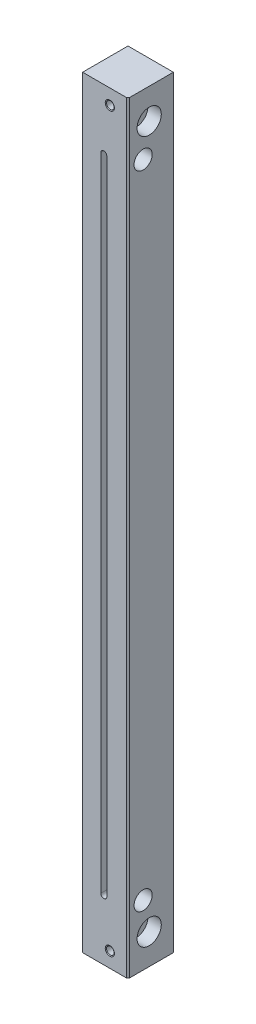
ISO-10303-21;
HEADER;
FILE_DESCRIPTION(('STEP AP214'),'2;1');
FILE_NAME('part.step','',(''),(''),'','','');
FILE_SCHEMA(('AUTOMOTIVE_DESIGN { 1 0 10303 214 1 1 1 1 }'));
ENDSEC;
DATA;
#1=APPLICATION_CONTEXT('core data for automotive mechanical design processes');
#2=APPLICATION_PROTOCOL_DEFINITION('international standard','automotive_design',2000,#1);
#3=PRODUCT_CONTEXT('',#1,'mechanical');
#4=PRODUCT('Part','Part','',(#3));
#5=PRODUCT_RELATED_PRODUCT_CATEGORY('part','',(#4));
#6=PRODUCT_DEFINITION_FORMATION('','',#4);
#7=PRODUCT_DEFINITION_CONTEXT('part definition',#1,'design');
#8=PRODUCT_DEFINITION('design','',#6,#7);
#9=PRODUCT_DEFINITION_SHAPE('','',#8);
#10=(LENGTH_UNIT() NAMED_UNIT(*) SI_UNIT(.MILLI.,.METRE.));
#11=(NAMED_UNIT(*) PLANE_ANGLE_UNIT() SI_UNIT($,.RADIAN.));
#12=(NAMED_UNIT(*) SI_UNIT($,.STERADIAN.) SOLID_ANGLE_UNIT());
#13=UNCERTAINTY_MEASURE_WITH_UNIT(LENGTH_MEASURE(1.E-05),#10,'distance_accuracy_value','');
#14=(GEOMETRIC_REPRESENTATION_CONTEXT(3) GLOBAL_UNCERTAINTY_ASSIGNED_CONTEXT((#13)) GLOBAL_UNIT_ASSIGNED_CONTEXT((#10,
#11,#12)) REPRESENTATION_CONTEXT('',''));
#15=CARTESIAN_POINT('',(0.,0.,0.));
#16=DIRECTION('',(0.,0.,1.));
#17=DIRECTION('',(1.,0.,0.));
#18=AXIS2_PLACEMENT_3D('',#15,#16,#17);
#19=CARTESIAN_POINT('',(0.,252.,15.));
#20=DIRECTION('',(0.,0.,-1.));
#21=DIRECTION('',(-1.,0.,0.));
#22=AXIS2_PLACEMENT_3D('',#19,#20,#21);
#23=PLANE('',#22);
#24=CARTESIAN_POINT('',(9.,5.,15.));
#25=DIRECTION('',(0.,0.,1.));
#26=DIRECTION('',(1.,0.,0.));
#27=AXIS2_PLACEMENT_3D('',#24,#25,#26);
#28=CIRCLE('',#27,1.525);
#29=CARTESIAN_POINT('',(10.525,5.,15.));
#30=VERTEX_POINT('',#29);
#31=EDGE_CURVE('E248',#30,#30,#28,.T.);
#32=ORIENTED_EDGE('',*,*,#31,.F.);
#33=EDGE_LOOP('',(#32));
#34=FACE_BOUND('',#33,.T.);
#35=CARTESIAN_POINT('',(9.,247.,15.));
#36=DIRECTION('',(0.,0.,1.));
#37=DIRECTION('',(1.,0.,0.));
#38=AXIS2_PLACEMENT_3D('',#35,#36,#37);
#39=CIRCLE('',#38,1.525);
#40=CARTESIAN_POINT('',(10.525,247.,15.));
#41=VERTEX_POINT('',#40);
#42=EDGE_CURVE('E257',#41,#41,#39,.T.);
#43=ORIENTED_EDGE('',*,*,#42,.F.);
#44=EDGE_LOOP('',(#43));
#45=FACE_BOUND('',#44,.T.);
#46=DIRECTION('',(0.,-1.,0.));
#47=VECTOR('',#46,1.);
#48=CARTESIAN_POINT('',(5.99999999999997,232.,15.));
#49=LINE('',#48,#47);
#50=CARTESIAN_POINT('',(5.99999999999997,232.,15.));
#51=VERTEX_POINT('',#50);
#52=CARTESIAN_POINT('',(6.,20.,15.));
#53=VERTEX_POINT('',#52);
#54=EDGE_CURVE('E268',#51,#53,#49,.T.);
#55=ORIENTED_EDGE('',*,*,#54,.F.);
#56=CARTESIAN_POINT('',(6.99999999999997,232.,15.));
#57=DIRECTION('',(0.,0.,1.));
#58=DIRECTION('',(1.,0.,0.));
#59=AXIS2_PLACEMENT_3D('',#56,#57,#58);
#60=CIRCLE('',#59,1.);
#61=CARTESIAN_POINT('',(7.99999999999997,232.,15.));
#62=VERTEX_POINT('',#61);
#63=EDGE_CURVE('E266',#62,#51,#60,.T.);
#64=ORIENTED_EDGE('',*,*,#63,.F.);
#65=DIRECTION('',(0.,1.,0.));
#66=VECTOR('',#65,1.);
#67=CARTESIAN_POINT('',(7.99999999999997,232.,15.));
#68=LINE('',#67,#66);
#69=CARTESIAN_POINT('',(8.,20.,15.));
#70=VERTEX_POINT('',#69);
#71=EDGE_CURVE('E274',#70,#62,#68,.T.);
#72=ORIENTED_EDGE('',*,*,#71,.F.);
#73=CARTESIAN_POINT('',(7.,20.,15.));
#74=DIRECTION('',(0.,0.,1.));
#75=DIRECTION('',(1.,0.,0.));
#76=AXIS2_PLACEMENT_3D('',#73,#74,#75);
#77=CIRCLE('',#76,1.);
#78=EDGE_CURVE('E271',#53,#70,#77,.T.);
#79=ORIENTED_EDGE('',*,*,#78,.F.);
#80=EDGE_LOOP('',(#55,#64,#72,#79));
#81=FACE_BOUND('',#80,.T.);
#82=DIRECTION('',(1.,0.,0.));
#83=VECTOR('',#82,1.);
#84=CARTESIAN_POINT('',(0.,0.,15.));
#85=LINE('',#84,#83);
#86=CARTESIAN_POINT('',(0.,0.,15.));
#87=VERTEX_POINT('',#86);
#88=CARTESIAN_POINT('',(14.5,0.,15.));
#89=VERTEX_POINT('',#88);
#90=EDGE_CURVE('E305',#87,#89,#85,.T.);
#91=ORIENTED_EDGE('',*,*,#90,.T.);
#92=DIRECTION('',(0.,1.,0.));
#93=VECTOR('',#92,1.);
#94=CARTESIAN_POINT('',(14.5,252.,15.));
#95=LINE('',#94,#93);
#96=CARTESIAN_POINT('',(14.5,252.,15.));
#97=VERTEX_POINT('',#96);
#98=EDGE_CURVE('E343',#89,#97,#95,.T.);
#99=ORIENTED_EDGE('',*,*,#98,.T.);
#100=DIRECTION('',(-1.,0.,0.));
#101=VECTOR('',#100,1.);
#102=CARTESIAN_POINT('',(0.,252.,15.));
#103=LINE('',#102,#101);
#104=CARTESIAN_POINT('',(0.,252.,15.));
#105=VERTEX_POINT('',#104);
#106=EDGE_CURVE('E405',#97,#105,#103,.T.);
#107=ORIENTED_EDGE('',*,*,#106,.T.);
#108=DIRECTION('',(0.,-1.,0.));
#109=VECTOR('',#108,1.);
#110=CARTESIAN_POINT('',(0.,0.,15.));
#111=LINE('',#110,#109);
#112=EDGE_CURVE('E308',#105,#87,#111,.T.);
#113=ORIENTED_EDGE('',*,*,#112,.T.);
#114=EDGE_LOOP('',(#91,#99,#107,#113));
#115=FACE_BOUND('',#114,.T.);
#116=ADVANCED_FACE('F38',(#34,#45,#81,#115),#23,.F.);
#117=CARTESIAN_POINT('',(0.,0.,15.));
#118=DIRECTION('',(1.,0.,0.));
#119=DIRECTION('',(0.,0.,-1.));
#120=AXIS2_PLACEMENT_3D('',#117,#118,#119);
#121=PLANE('',#120);
#122=CARTESIAN_POINT('',(0.,10.,8.));
#123=DIRECTION('',(1.,0.,0.));
#124=DIRECTION('',(0.,0.,-1.));
#125=AXIS2_PLACEMENT_3D('',#122,#123,#124);
#126=CIRCLE('',#125,2.25);
#127=CARTESIAN_POINT('',(0.,10.,5.75));
#128=VERTEX_POINT('',#127);
#129=EDGE_CURVE('E233',#128,#128,#126,.T.);
#130=ORIENTED_EDGE('',*,*,#129,.T.);
#131=EDGE_LOOP('',(#130));
#132=FACE_BOUND('',#131,.T.);
#133=CARTESIAN_POINT('',(0.,242.,8.));
#134=DIRECTION('',(1.,0.,0.));
#135=DIRECTION('',(0.,0.,-1.));
#136=AXIS2_PLACEMENT_3D('',#133,#134,#135);
#137=CIRCLE('',#136,2.25);
#138=CARTESIAN_POINT('',(0.,242.,5.75));
#139=VERTEX_POINT('',#138);
#140=EDGE_CURVE('E245',#139,#139,#137,.T.);
#141=ORIENTED_EDGE('',*,*,#140,.T.);
#142=EDGE_LOOP('',(#141));
#143=FACE_BOUND('',#142,.T.);
#144=DIRECTION('',(0.,0.,-1.));
#145=VECTOR('',#144,1.);
#146=CARTESIAN_POINT('',(0.,238.5,21.));
#147=LINE('',#146,#145);
#148=CARTESIAN_POINT('',(0.,238.5,7.));
#149=VERTEX_POINT('',#148);
#150=CARTESIAN_POINT('',(0.,238.5,0.));
#151=VERTEX_POINT('',#150);
#152=EDGE_CURVE('E302',#149,#151,#147,.T.);
#153=ORIENTED_EDGE('',*,*,#152,.F.);
#154=CARTESIAN_POINT('',(0.,233.5,7.));
#155=DIRECTION('',(1.,0.,0.));
#156=DIRECTION('',(0.,0.,-1.));
#157=AXIS2_PLACEMENT_3D('',#154,#155,#156);
#158=CIRCLE('',#157,5.);
#159=CARTESIAN_POINT('',(0.,233.5,12.));
#160=VERTEX_POINT('',#159);
#161=EDGE_CURVE('E339',#149,#160,#158,.T.);
#162=ORIENTED_EDGE('',*,*,#161,.T.);
#163=DIRECTION('',(0.,-1.,0.));
#164=VECTOR('',#163,1.);
#165=CARTESIAN_POINT('',(0.,13.5,12.));
#166=LINE('',#165,#164);
#167=CARTESIAN_POINT('',(0.,18.5,12.));
#168=VERTEX_POINT('',#167);
#169=EDGE_CURVE('E280',#160,#168,#166,.T.);
#170=ORIENTED_EDGE('',*,*,#169,.T.);
#171=CARTESIAN_POINT('',(0.,18.5,7.));
#172=DIRECTION('',(1.,0.,0.));
#173=DIRECTION('',(0.,0.,-1.));
#174=AXIS2_PLACEMENT_3D('',#171,#172,#173);
#175=CIRCLE('',#174,5.);
#176=CARTESIAN_POINT('',(0.,13.5,7.));
#177=VERTEX_POINT('',#176);
#178=EDGE_CURVE('E341',#168,#177,#175,.T.);
#179=ORIENTED_EDGE('',*,*,#178,.T.);
#180=DIRECTION('',(0.,0.,-1.));
#181=VECTOR('',#180,1.);
#182=CARTESIAN_POINT('',(0.,13.5,21.));
#183=LINE('',#182,#181);
#184=CARTESIAN_POINT('',(0.,13.5,0.));
#185=VERTEX_POINT('',#184);
#186=EDGE_CURVE('E297',#177,#185,#183,.T.);
#187=ORIENTED_EDGE('',*,*,#186,.T.);
#188=DIRECTION('',(0.,-1.,0.));
#189=VECTOR('',#188,1.);
#190=CARTESIAN_POINT('',(0.,0.,0.));
#191=LINE('',#190,#189);
#192=CARTESIAN_POINT('',(0.,0.,0.));
#193=VERTEX_POINT('',#192);
#194=EDGE_CURVE('E321',#185,#193,#191,.T.);
#195=ORIENTED_EDGE('',*,*,#194,.T.);
#196=DIRECTION('',(0.,0.,-1.));
#197=VECTOR('',#196,1.);
#198=CARTESIAN_POINT('',(0.,0.,15.));
#199=LINE('',#198,#197);
#200=EDGE_CURVE('E312',#87,#193,#199,.T.);
#201=ORIENTED_EDGE('',*,*,#200,.F.);
#202=ORIENTED_EDGE('',*,*,#112,.F.);
#203=DIRECTION('',(0.,0.,-1.));
#204=VECTOR('',#203,1.);
#205=CARTESIAN_POINT('',(0.,252.,15.));
#206=LINE('',#205,#204);
#207=CARTESIAN_POINT('',(0.,252.,0.));
#208=VERTEX_POINT('',#207);
#209=EDGE_CURVE('E398',#105,#208,#206,.T.);
#210=ORIENTED_EDGE('',*,*,#209,.T.);
#211=EDGE_CURVE('E395',#208,#151,#191,.T.);
#212=ORIENTED_EDGE('',*,*,#211,.T.);
#213=EDGE_LOOP('',(#153,#162,#170,#179,#187,#195,#201,#202,#210,#212));
#214=FACE_BOUND('',#213,.T.);
#215=ADVANCED_FACE('F384',(#132,#143,#214),#121,.F.);
#216=CARTESIAN_POINT('',(0.,0.,15.));
#217=DIRECTION('',(0.,1.,0.));
#218=DIRECTION('',(0.,0.,1.));
#219=AXIS2_PLACEMENT_3D('',#216,#217,#218);
#220=PLANE('',#219);
#221=DIRECTION('',(0.,0.,-1.));
#222=VECTOR('',#221,1.);
#223=CARTESIAN_POINT('',(15.,0.,15.));
#224=LINE('',#223,#222);
#225=CARTESIAN_POINT('',(15.,0.,14.5));
#226=VERTEX_POINT('',#225);
#227=CARTESIAN_POINT('',(15.,0.,0.));
#228=VERTEX_POINT('',#227);
#229=EDGE_CURVE('E412',#226,#228,#224,.T.);
#230=ORIENTED_EDGE('',*,*,#229,.F.);
#231=DIRECTION('',(0.707106781186528,0.,-0.707106781186567));
#232=VECTOR('',#231,1.);
#233=CARTESIAN_POINT('',(14.5,0.,15.));
#234=LINE('',#233,#232);
#235=EDGE_CURVE('E350',#226,#89,#234,.F.);
#236=ORIENTED_EDGE('',*,*,#235,.T.);
#237=ORIENTED_EDGE('',*,*,#90,.F.);
#238=ORIENTED_EDGE('',*,*,#200,.T.);
#239=DIRECTION('',(1.,0.,0.));
#240=VECTOR('',#239,1.);
#241=CARTESIAN_POINT('',(0.,0.,0.));
#242=LINE('',#241,#240);
#243=EDGE_CURVE('E400',#193,#228,#242,.T.);
#244=ORIENTED_EDGE('',*,*,#243,.T.);
#245=EDGE_LOOP('',(#230,#236,#237,#238,#244));
#246=FACE_BOUND('',#245,.T.);
#247=ADVANCED_FACE('F449',(#246),#220,.F.);
#248=CARTESIAN_POINT('',(15.,0.,15.));
#249=DIRECTION('',(-1.,0.,0.));
#250=DIRECTION('',(0.,0.,1.));
#251=AXIS2_PLACEMENT_3D('',#248,#249,#250);
#252=PLANE('',#251);
#253=CARTESIAN_POINT('',(15.,20.,10.));
#254=DIRECTION('',(1.,0.,0.));
#255=DIRECTION('',(0.,0.,-1.));
#256=AXIS2_PLACEMENT_3D('',#253,#254,#255);
#257=CIRCLE('',#256,3.);
#258=CARTESIAN_POINT('',(15.,20.,7.));
#259=VERTEX_POINT('',#258);
#260=EDGE_CURVE('E212',#259,#259,#257,.T.);
#261=ORIENTED_EDGE('',*,*,#260,.F.);
#262=EDGE_LOOP('',(#261));
#263=FACE_BOUND('',#262,.T.);
#264=CARTESIAN_POINT('',(15.,232.,10.));
#265=DIRECTION('',(1.,0.,0.));
#266=DIRECTION('',(0.,0.,-1.));
#267=AXIS2_PLACEMENT_3D('',#264,#265,#266);
#268=CIRCLE('',#267,3.);
#269=CARTESIAN_POINT('',(15.,232.,7.));
#270=VERTEX_POINT('',#269);
#271=EDGE_CURVE('E216',#270,#270,#268,.T.);
#272=ORIENTED_EDGE('',*,*,#271,.F.);
#273=EDGE_LOOP('',(#272));
#274=FACE_BOUND('',#273,.T.);
#275=CARTESIAN_POINT('',(15.,10.,8.));
#276=DIRECTION('',(1.,0.,0.));
#277=DIRECTION('',(0.,0.,-1.));
#278=AXIS2_PLACEMENT_3D('',#275,#276,#277);
#279=CIRCLE('',#278,4.);
#280=CARTESIAN_POINT('',(15.,10.,4.));
#281=VERTEX_POINT('',#280);
#282=EDGE_CURVE('E222',#281,#281,#279,.T.);
#283=ORIENTED_EDGE('',*,*,#282,.F.);
#284=EDGE_LOOP('',(#283));
#285=FACE_BOUND('',#284,.T.);
#286=CARTESIAN_POINT('',(15.,242.,8.));
#287=DIRECTION('',(1.,0.,0.));
#288=DIRECTION('',(0.,0.,-1.));
#289=AXIS2_PLACEMENT_3D('',#286,#287,#288);
#290=CIRCLE('',#289,4.);
#291=CARTESIAN_POINT('',(15.,242.,4.));
#292=VERTEX_POINT('',#291);
#293=EDGE_CURVE('E236',#292,#292,#290,.T.);
#294=ORIENTED_EDGE('',*,*,#293,.F.);
#295=EDGE_LOOP('',(#294));
#296=FACE_BOUND('',#295,.T.);
#297=DIRECTION('',(0.,0.,-1.));
#298=VECTOR('',#297,1.);
#299=CARTESIAN_POINT('',(15.,252.,15.));
#300=LINE('',#299,#298);
#301=CARTESIAN_POINT('',(15.,252.,14.5));
#302=VERTEX_POINT('',#301);
#303=CARTESIAN_POINT('',(15.,252.,0.));
#304=VERTEX_POINT('',#303);
#305=EDGE_CURVE('E411',#302,#304,#300,.T.);
#306=ORIENTED_EDGE('',*,*,#305,.F.);
#307=DIRECTION('',(0.,-1.,0.));
#308=VECTOR('',#307,1.);
#309=CARTESIAN_POINT('',(15.,0.,14.5));
#310=LINE('',#309,#308);
#311=EDGE_CURVE('E348',#302,#226,#310,.T.);
#312=ORIENTED_EDGE('',*,*,#311,.T.);
#313=ORIENTED_EDGE('',*,*,#229,.T.);
#314=DIRECTION('',(0.,1.,0.));
#315=VECTOR('',#314,1.);
#316=CARTESIAN_POINT('',(15.,0.,0.));
#317=LINE('',#316,#315);
#318=EDGE_CURVE('E403',#228,#304,#317,.T.);
#319=ORIENTED_EDGE('',*,*,#318,.T.);
#320=EDGE_LOOP('',(#306,#312,#313,#319));
#321=FACE_BOUND('',#320,.T.);
#322=ADVANCED_FACE('F463',(#263,#274,#285,#296,#321),#252,.F.);
#323=CARTESIAN_POINT('',(0.,252.,15.));
#324=DIRECTION('',(0.,-1.,0.));
#325=DIRECTION('',(0.,0.,-1.));
#326=AXIS2_PLACEMENT_3D('',#323,#324,#325);
#327=PLANE('',#326);
#328=ORIENTED_EDGE('',*,*,#106,.F.);
#329=DIRECTION('',(-0.707106781186528,0.,0.707106781186567));
#330=VECTOR('',#329,1.);
#331=CARTESIAN_POINT('',(14.5,252.,15.));
#332=LINE('',#331,#330);
#333=EDGE_CURVE('E346',#97,#302,#332,.F.);
#334=ORIENTED_EDGE('',*,*,#333,.T.);
#335=ORIENTED_EDGE('',*,*,#305,.T.);
#336=DIRECTION('',(-1.,0.,0.));
#337=VECTOR('',#336,1.);
#338=CARTESIAN_POINT('',(0.,252.,0.));
#339=LINE('',#338,#337);
#340=EDGE_CURVE('E311',#304,#208,#339,.T.);
#341=ORIENTED_EDGE('',*,*,#340,.T.);
#342=ORIENTED_EDGE('',*,*,#209,.F.);
#343=EDGE_LOOP('',(#328,#334,#335,#341,#342));
#344=FACE_BOUND('',#343,.T.);
#345=ADVANCED_FACE('F459',(#344),#327,.F.);
#346=CARTESIAN_POINT('',(0.,252.,0.));
#347=DIRECTION('',(0.,0.,-1.));
#348=DIRECTION('',(-1.,0.,0.));
#349=AXIS2_PLACEMENT_3D('',#346,#347,#348);
#350=PLANE('',#349);
#351=CARTESIAN_POINT('',(12.,101.,-1.25767452008319E-13));
#352=DIRECTION('',(0.,0.,-1.));
#353=DIRECTION('',(-1.,0.,0.));
#354=AXIS2_PLACEMENT_3D('',#351,#352,#353);
#355=CIRCLE('',#354,1.02500000000005);
#356=CARTESIAN_POINT('',(10.9749999999999,101.,-1.25767452008319E-13));
#357=VERTEX_POINT('',#356);
#358=EDGE_CURVE('E185',#357,#357,#355,.T.);
#359=ORIENTED_EDGE('',*,*,#358,.F.);
#360=EDGE_LOOP('',(#359));
#361=FACE_BOUND('',#360,.T.);
#362=CARTESIAN_POINT('',(12.,201.,-1.25767452008319E-13));
#363=DIRECTION('',(0.,0.,-1.));
#364=DIRECTION('',(-1.,0.,0.));
#365=AXIS2_PLACEMENT_3D('',#362,#363,#364);
#366=CIRCLE('',#365,1.02500000000005);
#367=CARTESIAN_POINT('',(10.9749999999999,201.,-1.25767452008319E-13));
#368=VERTEX_POINT('',#367);
#369=EDGE_CURVE('E178',#368,#368,#366,.T.);
#370=ORIENTED_EDGE('',*,*,#369,.F.);
#371=EDGE_LOOP('',(#370));
#372=FACE_BOUND('',#371,.T.);
#373=CARTESIAN_POINT('',(12.,151.,-1.25767452008319E-13));
#374=DIRECTION('',(0.,0.,-1.));
#375=DIRECTION('',(-1.,0.,0.));
#376=AXIS2_PLACEMENT_3D('',#373,#374,#375);
#377=CIRCLE('',#376,1.02500000000005);
#378=CARTESIAN_POINT('',(10.9749999999999,151.,-1.25767452008319E-13));
#379=VERTEX_POINT('',#378);
#380=EDGE_CURVE('E194',#379,#379,#377,.T.);
#381=ORIENTED_EDGE('',*,*,#380,.F.);
#382=EDGE_LOOP('',(#381));
#383=FACE_BOUND('',#382,.T.);
#384=CARTESIAN_POINT('',(12.,51.,-1.25767452008319E-13));
#385=DIRECTION('',(0.,0.,-1.));
#386=DIRECTION('',(-1.,0.,0.));
#387=AXIS2_PLACEMENT_3D('',#384,#385,#386);
#388=CIRCLE('',#387,1.02500000000005);
#389=CARTESIAN_POINT('',(10.9749999999999,51.,-1.25767452008319E-13));
#390=VERTEX_POINT('',#389);
#391=EDGE_CURVE('E203',#390,#390,#388,.T.);
#392=ORIENTED_EDGE('',*,*,#391,.F.);
#393=EDGE_LOOP('',(#392));
#394=FACE_BOUND('',#393,.T.);
#395=DIRECTION('',(0.,1.,0.));
#396=VECTOR('',#395,1.);
#397=CARTESIAN_POINT('',(8.99999999999989,238.5,0.));
#398=LINE('',#397,#396);
#399=CARTESIAN_POINT('',(8.99999999999992,13.5,0.));
#400=VERTEX_POINT('',#399);
#401=CARTESIAN_POINT('',(8.99999999999989,238.5,0.));
#402=VERTEX_POINT('',#401);
#403=EDGE_CURVE('E352',#400,#402,#398,.T.);
#404=ORIENTED_EDGE('',*,*,#403,.T.);
#405=DIRECTION('',(-1.,0.,0.));
#406=VECTOR('',#405,1.);
#407=CARTESIAN_POINT('',(0.,238.5,0.));
#408=LINE('',#407,#406);
#409=EDGE_CURVE('E292',#402,#151,#408,.T.);
#410=ORIENTED_EDGE('',*,*,#409,.T.);
#411=ORIENTED_EDGE('',*,*,#211,.F.);
#412=ORIENTED_EDGE('',*,*,#340,.F.);
#413=ORIENTED_EDGE('',*,*,#318,.F.);
#414=ORIENTED_EDGE('',*,*,#243,.F.);
#415=ORIENTED_EDGE('',*,*,#194,.F.);
#416=DIRECTION('',(1.,0.,0.));
#417=VECTOR('',#416,1.);
#418=CARTESIAN_POINT('',(7.99999999999997,13.5,0.));
#419=LINE('',#418,#417);
#420=EDGE_CURVE('E295',#185,#400,#419,.T.);
#421=ORIENTED_EDGE('',*,*,#420,.T.);
#422=EDGE_LOOP('',(#404,#410,#411,#412,#413,#414,#415,#421));
#423=FACE_BOUND('',#422,.T.);
#424=ADVANCED_FACE('F357',(#361,#372,#383,#394,#423),#350,.T.);
#425=CARTESIAN_POINT('',(0.,238.5,21.));
#426=DIRECTION('',(0.,1.,0.));
#427=DIRECTION('',(0.,0.,1.));
#428=AXIS2_PLACEMENT_3D('',#425,#426,#427);
#429=PLANE('',#428);
#430=DIRECTION('',(0.,0.,-1.));
#431=VECTOR('',#430,1.);
#432=CARTESIAN_POINT('',(7.99999999999994,238.5,21.));
#433=LINE('',#432,#431);
#434=CARTESIAN_POINT('',(7.99999999999994,238.5,7.));
#435=VERTEX_POINT('',#434);
#436=CARTESIAN_POINT('',(7.99999999999994,238.5,0.999999999999973));
#437=VERTEX_POINT('',#436);
#438=EDGE_CURVE('E300',#435,#437,#433,.T.);
#439=ORIENTED_EDGE('',*,*,#438,.F.);
#440=DIRECTION('',(-1.,0.,0.));
#441=VECTOR('',#440,1.);
#442=CARTESIAN_POINT('',(0.,238.5,7.));
#443=LINE('',#442,#441);
#444=EDGE_CURVE('E324',#435,#149,#443,.T.);
#445=ORIENTED_EDGE('',*,*,#444,.T.);
#446=ORIENTED_EDGE('',*,*,#152,.T.);
#447=ORIENTED_EDGE('',*,*,#409,.F.);
#448=DIRECTION('',(-0.707106781186538,0.,0.707106781186557));
#449=VECTOR('',#448,1.);
#450=CARTESIAN_POINT('',(-5.99999999999993,238.5,15.0000000000002));
#451=LINE('',#450,#449);
#452=EDGE_CURVE('E46',#402,#437,#451,.T.);
#453=ORIENTED_EDGE('',*,*,#452,.T.);
#454=EDGE_LOOP('',(#439,#445,#446,#447,#453));
#455=FACE_BOUND('',#454,.T.);
#456=ADVANCED_FACE('F393',(#455),#429,.F.);
#457=CARTESIAN_POINT('',(7.99999999999994,238.5,21.));
#458=DIRECTION('',(1.,0.,0.));
#459=DIRECTION('',(0.,1.,0.));
#460=AXIS2_PLACEMENT_3D('',#457,#458,#459);
#461=PLANE('',#460);
#462=ORIENTED_EDGE('',*,*,#438,.T.);
#463=DIRECTION('',(0.,-1.,0.));
#464=VECTOR('',#463,1.);
#465=CARTESIAN_POINT('',(7.99999999999997,13.5,0.999999999999973));
#466=LINE('',#465,#464);
#467=CARTESIAN_POINT('',(7.99999999999997,13.5,0.999999999999973));
#468=VERTEX_POINT('',#467);
#469=EDGE_CURVE('E53',#437,#468,#466,.T.);
#470=ORIENTED_EDGE('',*,*,#469,.T.);
#471=DIRECTION('',(0.,0.,-1.));
#472=VECTOR('',#471,1.);
#473=CARTESIAN_POINT('',(7.99999999999997,13.5,21.));
#474=LINE('',#473,#472);
#475=CARTESIAN_POINT('',(7.99999999999997,13.5,7.));
#476=VERTEX_POINT('',#475);
#477=EDGE_CURVE('E298',#476,#468,#474,.T.);
#478=ORIENTED_EDGE('',*,*,#477,.F.);
#479=CARTESIAN_POINT('',(7.99999999999997,18.5,7.));
#480=DIRECTION('',(1.,0.,0.));
#481=DIRECTION('',(0.,1.,0.));
#482=AXIS2_PLACEMENT_3D('',#479,#480,#481);
#483=CIRCLE('',#482,5.);
#484=CARTESIAN_POINT('',(7.99999999999994,18.5,12.));
#485=VERTEX_POINT('',#484);
#486=EDGE_CURVE('E331',#476,#485,#483,.F.);
#487=ORIENTED_EDGE('',*,*,#486,.T.);
#488=DIRECTION('',(0.,1.,0.));
#489=VECTOR('',#488,1.);
#490=CARTESIAN_POINT('',(7.99999999999994,13.5,12.));
#491=LINE('',#490,#489);
#492=CARTESIAN_POINT('',(8.,20.,12.));
#493=VERTEX_POINT('',#492);
#494=EDGE_CURVE('E290',#485,#493,#491,.T.);
#495=ORIENTED_EDGE('',*,*,#494,.T.);
#496=DIRECTION('',(0.,0.,1.));
#497=VECTOR('',#496,1.);
#498=CARTESIAN_POINT('',(8.,20.,7.));
#499=LINE('',#498,#497);
#500=EDGE_CURVE('E281',#493,#70,#499,.T.);
#501=ORIENTED_EDGE('',*,*,#500,.T.);
#502=ORIENTED_EDGE('',*,*,#71,.T.);
#503=DIRECTION('',(0.,0.,1.));
#504=VECTOR('',#503,1.);
#505=CARTESIAN_POINT('',(7.99999999999997,232.,7.));
#506=LINE('',#505,#504);
#507=CARTESIAN_POINT('',(7.99999999999997,232.,12.));
#508=VERTEX_POINT('',#507);
#509=EDGE_CURVE('E278',#508,#62,#506,.T.);
#510=ORIENTED_EDGE('',*,*,#509,.F.);
#511=CARTESIAN_POINT('',(7.99999999999994,233.5,12.));
#512=VERTEX_POINT('',#511);
#513=EDGE_CURVE('E289',#508,#512,#491,.T.);
#514=ORIENTED_EDGE('',*,*,#513,.T.);
#515=CARTESIAN_POINT('',(7.99999999999994,233.5,7.));
#516=DIRECTION('',(1.,0.,0.));
#517=DIRECTION('',(0.,1.,0.));
#518=AXIS2_PLACEMENT_3D('',#515,#516,#517);
#519=CIRCLE('',#518,5.);
#520=EDGE_CURVE('E333',#512,#435,#519,.F.);
#521=ORIENTED_EDGE('',*,*,#520,.T.);
#522=EDGE_LOOP('',(#462,#470,#478,#487,#495,#501,#502,#510,#514,#521));
#523=FACE_BOUND('',#522,.T.);
#524=ADVANCED_FACE('F368',(#523),#461,.F.);
#525=CARTESIAN_POINT('',(0.,13.5,21.));
#526=DIRECTION('',(0.,-1.,0.));
#527=DIRECTION('',(0.,0.,-1.));
#528=AXIS2_PLACEMENT_3D('',#525,#526,#527);
#529=PLANE('',#528);
#530=ORIENTED_EDGE('',*,*,#186,.F.);
#531=DIRECTION('',(1.,0.,0.));
#532=VECTOR('',#531,1.);
#533=CARTESIAN_POINT('',(0.,13.5,7.));
#534=LINE('',#533,#532);
#535=EDGE_CURVE('E335',#177,#476,#534,.T.);
#536=ORIENTED_EDGE('',*,*,#535,.T.);
#537=ORIENTED_EDGE('',*,*,#477,.T.);
#538=DIRECTION('',(0.707106781186538,0.,-0.707106781186557));
#539=VECTOR('',#538,1.);
#540=CARTESIAN_POINT('',(-5.9999999999999,13.5,15.0000000000002));
#541=LINE('',#540,#539);
#542=EDGE_CURVE('E11',#468,#400,#541,.T.);
#543=ORIENTED_EDGE('',*,*,#542,.T.);
#544=ORIENTED_EDGE('',*,*,#420,.F.);
#545=EDGE_LOOP('',(#530,#536,#537,#543,#544));
#546=FACE_BOUND('',#545,.T.);
#547=ADVANCED_FACE('F366',(#546),#529,.F.);
#548=CARTESIAN_POINT('',(0.,238.5,12.));
#549=DIRECTION('',(0.,0.,-1.));
#550=DIRECTION('',(-1.,0.,0.));
#551=AXIS2_PLACEMENT_3D('',#548,#549,#550);
#552=PLANE('',#551);
#553=ORIENTED_EDGE('',*,*,#169,.F.);
#554=DIRECTION('',(-1.,0.,0.));
#555=VECTOR('',#554,1.);
#556=CARTESIAN_POINT('',(0.,233.5,12.));
#557=LINE('',#556,#555);
#558=EDGE_CURVE('E329',#160,#512,#557,.F.);
#559=ORIENTED_EDGE('',*,*,#558,.T.);
#560=ORIENTED_EDGE('',*,*,#513,.F.);
#561=CARTESIAN_POINT('',(6.99999999999997,232.,12.));
#562=DIRECTION('',(0.,0.,-1.));
#563=DIRECTION('',(-1.,0.,0.));
#564=AXIS2_PLACEMENT_3D('',#561,#562,#563);
#565=CIRCLE('',#564,1.);
#566=CARTESIAN_POINT('',(5.99999999999997,232.,12.));
#567=VERTEX_POINT('',#566);
#568=EDGE_CURVE('E322',#567,#508,#565,.T.);
#569=ORIENTED_EDGE('',*,*,#568,.F.);
#570=DIRECTION('',(0.,1.,0.));
#571=VECTOR('',#570,1.);
#572=CARTESIAN_POINT('',(5.99999999999997,238.5,12.));
#573=LINE('',#572,#571);
#574=CARTESIAN_POINT('',(6.,20.,12.));
#575=VERTEX_POINT('',#574);
#576=EDGE_CURVE('E416',#575,#567,#573,.T.);
#577=ORIENTED_EDGE('',*,*,#576,.F.);
#578=CARTESIAN_POINT('',(7.,20.,12.));
#579=DIRECTION('',(0.,0.,-1.));
#580=DIRECTION('',(-1.,0.,0.));
#581=AXIS2_PLACEMENT_3D('',#578,#579,#580);
#582=CIRCLE('',#581,1.);
#583=EDGE_CURVE('E379',#493,#575,#582,.T.);
#584=ORIENTED_EDGE('',*,*,#583,.F.);
#585=ORIENTED_EDGE('',*,*,#494,.F.);
#586=DIRECTION('',(1.,0.,0.));
#587=VECTOR('',#586,1.);
#588=CARTESIAN_POINT('',(0.,18.5,12.));
#589=LINE('',#588,#587);
#590=EDGE_CURVE('E327',#485,#168,#589,.F.);
#591=ORIENTED_EDGE('',*,*,#590,.T.);
#592=EDGE_LOOP('',(#553,#559,#560,#569,#577,#584,#585,#591));
#593=FACE_BOUND('',#592,.T.);
#594=ADVANCED_FACE('F376',(#593),#552,.T.);
#595=CARTESIAN_POINT('',(6.99999999999997,232.,7.));
#596=DIRECTION('',(0.,0.,1.));
#597=DIRECTION('',(1.,0.,0.));
#598=AXIS2_PLACEMENT_3D('',#595,#596,#597);
#599=CYLINDRICAL_SURFACE('',#598,1.);
#600=ORIENTED_EDGE('',*,*,#568,.T.);
#601=ORIENTED_EDGE('',*,*,#509,.T.);
#602=ORIENTED_EDGE('',*,*,#63,.T.);
#603=DIRECTION('',(0.,0.,1.));
#604=VECTOR('',#603,1.);
#605=CARTESIAN_POINT('',(5.99999999999997,232.,7.));
#606=LINE('',#605,#604);
#607=EDGE_CURVE('E277',#567,#51,#606,.T.);
#608=ORIENTED_EDGE('',*,*,#607,.F.);
#609=EDGE_LOOP('',(#600,#601,#602,#608));
#610=FACE_BOUND('',#609,.T.);
#611=ADVANCED_FACE('F425',(#610),#599,.F.);
#612=CARTESIAN_POINT('',(7.,20.,7.));
#613=DIRECTION('',(0.,0.,1.));
#614=DIRECTION('',(1.,0.,0.));
#615=AXIS2_PLACEMENT_3D('',#612,#613,#614);
#616=CYLINDRICAL_SURFACE('',#615,1.);
#617=ORIENTED_EDGE('',*,*,#583,.T.);
#618=DIRECTION('',(0.,0.,1.));
#619=VECTOR('',#618,1.);
#620=CARTESIAN_POINT('',(6.,20.,7.));
#621=LINE('',#620,#619);
#622=EDGE_CURVE('E283',#575,#53,#621,.T.);
#623=ORIENTED_EDGE('',*,*,#622,.T.);
#624=ORIENTED_EDGE('',*,*,#78,.T.);
#625=ORIENTED_EDGE('',*,*,#500,.F.);
#626=EDGE_LOOP('',(#617,#623,#624,#625));
#627=FACE_BOUND('',#626,.T.);
#628=ADVANCED_FACE('F433',(#627),#616,.F.);
#629=CARTESIAN_POINT('',(5.99999999999997,232.,7.));
#630=DIRECTION('',(-1.,0.,0.));
#631=DIRECTION('',(0.,-1.,0.));
#632=AXIS2_PLACEMENT_3D('',#629,#630,#631);
#633=PLANE('',#632);
#634=ORIENTED_EDGE('',*,*,#576,.T.);
#635=ORIENTED_EDGE('',*,*,#607,.T.);
#636=ORIENTED_EDGE('',*,*,#54,.T.);
#637=ORIENTED_EDGE('',*,*,#622,.F.);
#638=EDGE_LOOP('',(#634,#635,#636,#637));
#639=FACE_BOUND('',#638,.T.);
#640=ADVANCED_FACE('F432',(#639),#633,.F.);
#641=CARTESIAN_POINT('',(0.,233.5,7.));
#642=DIRECTION('',(-1.,0.,0.));
#643=DIRECTION('',(0.,0.,1.));
#644=AXIS2_PLACEMENT_3D('',#641,#642,#643);
#645=CYLINDRICAL_SURFACE('',#644,5.);
#646=ORIENTED_EDGE('',*,*,#520,.F.);
#647=ORIENTED_EDGE('',*,*,#558,.F.);
#648=ORIENTED_EDGE('',*,*,#161,.F.);
#649=ORIENTED_EDGE('',*,*,#444,.F.);
#650=EDGE_LOOP('',(#646,#647,#648,#649));
#651=FACE_BOUND('',#650,.T.);
#652=ADVANCED_FACE('F390',(#651),#645,.F.);
#653=CARTESIAN_POINT('',(0.,18.5,7.));
#654=DIRECTION('',(1.,0.,0.));
#655=DIRECTION('',(0.,0.,-1.));
#656=AXIS2_PLACEMENT_3D('',#653,#654,#655);
#657=CYLINDRICAL_SURFACE('',#656,5.);
#658=ORIENTED_EDGE('',*,*,#178,.F.);
#659=ORIENTED_EDGE('',*,*,#590,.F.);
#660=ORIENTED_EDGE('',*,*,#486,.F.);
#661=ORIENTED_EDGE('',*,*,#535,.F.);
#662=EDGE_LOOP('',(#658,#659,#660,#661));
#663=FACE_BOUND('',#662,.T.);
#664=ADVANCED_FACE('F381',(#663),#657,.F.);
#665=CARTESIAN_POINT('',(14.5,252.,15.));
#666=DIRECTION('',(-0.707106781186567,0.,-0.707106781186528));
#667=DIRECTION('',(-0.707106781186528,0.,0.707106781186567));
#668=AXIS2_PLACEMENT_3D('',#665,#666,#667);
#669=PLANE('',#668);
#670=ORIENTED_EDGE('',*,*,#235,.F.);
#671=ORIENTED_EDGE('',*,*,#311,.F.);
#672=ORIENTED_EDGE('',*,*,#333,.F.);
#673=ORIENTED_EDGE('',*,*,#98,.F.);
#674=EDGE_LOOP('',(#670,#671,#672,#673));
#675=FACE_BOUND('',#674,.T.);
#676=ADVANCED_FACE('F473',(#675),#669,.F.);
#677=CARTESIAN_POINT('',(9.,247.,6.5));
#678=DIRECTION('',(0.,0.,1.));
#679=DIRECTION('',(1.,0.,0.));
#680=AXIS2_PLACEMENT_3D('',#677,#678,#679);
#681=CONICAL_SURFACE('',#680,1.25,1.02974425867665);
#682=CARTESIAN_POINT('',(9.,247.,5.74892422621555));
#683=VERTEX_POINT('',#682);
#684=VERTEX_LOOP('',#683);
#685=FACE_BOUND('',#684,.T.);
#686=CARTESIAN_POINT('',(9.,247.,6.5));
#687=DIRECTION('',(0.,0.,1.));
#688=DIRECTION('',(1.,0.,0.));
#689=AXIS2_PLACEMENT_3D('',#686,#687,#688);
#690=CIRCLE('',#689,1.25);
#691=CARTESIAN_POINT('',(10.25,247.,6.5));
#692=VERTEX_POINT('',#691);
#693=EDGE_CURVE('E263',#692,#692,#690,.T.);
#694=ORIENTED_EDGE('',*,*,#693,.T.);
#695=EDGE_LOOP('',(#694));
#696=FACE_BOUND('',#695,.T.);
#697=ADVANCED_FACE('F475',(#685,#696),#681,.F.);
#698=CARTESIAN_POINT('',(9.,247.,15.));
#699=DIRECTION('',(0.,0.,1.));
#700=DIRECTION('',(1.,0.,0.));
#701=AXIS2_PLACEMENT_3D('',#698,#699,#700);
#702=CYLINDRICAL_SURFACE('',#701,1.25);
#703=ORIENTED_EDGE('',*,*,#693,.F.);
#704=EDGE_LOOP('',(#703));
#705=FACE_BOUND('',#704,.T.);
#706=CARTESIAN_POINT('',(9.,247.,14.8412286759729));
#707=DIRECTION('',(0.,0.,1.));
#708=DIRECTION('',(1.,0.,0.));
#709=AXIS2_PLACEMENT_3D('',#706,#707,#708);
#710=CIRCLE('',#709,1.25);
#711=CARTESIAN_POINT('',(10.25,247.,14.8412286759729));
#712=VERTEX_POINT('',#711);
#713=EDGE_CURVE('E260',#712,#712,#710,.T.);
#714=ORIENTED_EDGE('',*,*,#713,.T.);
#715=EDGE_LOOP('',(#714));
#716=FACE_BOUND('',#715,.T.);
#717=ADVANCED_FACE('F480',(#705,#716),#702,.F.);
#718=CARTESIAN_POINT('',(9.,247.,15.));
#719=DIRECTION('',(0.,0.,1.));
#720=DIRECTION('',(1.,0.,0.));
#721=AXIS2_PLACEMENT_3D('',#718,#719,#720);
#722=CONICAL_SURFACE('',#721,1.525,1.0471975511966);
#723=ORIENTED_EDGE('',*,*,#713,.F.);
#724=EDGE_LOOP('',(#723));
#725=FACE_BOUND('',#724,.T.);
#726=ORIENTED_EDGE('',*,*,#42,.T.);
#727=EDGE_LOOP('',(#726));
#728=FACE_BOUND('',#727,.T.);
#729=ADVANCED_FACE('F493',(#725,#728),#722,.F.);
#730=CARTESIAN_POINT('',(9.,5.,6.5));
#731=DIRECTION('',(0.,0.,1.));
#732=DIRECTION('',(1.,0.,0.));
#733=AXIS2_PLACEMENT_3D('',#730,#731,#732);
#734=CONICAL_SURFACE('',#733,1.25,1.02974425867665);
#735=CARTESIAN_POINT('',(9.,5.,5.74892422621555));
#736=VERTEX_POINT('',#735);
#737=VERTEX_LOOP('',#736);
#738=FACE_BOUND('',#737,.T.);
#739=CARTESIAN_POINT('',(9.,5.,6.5));
#740=DIRECTION('',(0.,0.,1.));
#741=DIRECTION('',(1.,0.,0.));
#742=AXIS2_PLACEMENT_3D('',#739,#740,#741);
#743=CIRCLE('',#742,1.25);
#744=CARTESIAN_POINT('',(10.25,5.,6.5));
#745=VERTEX_POINT('',#744);
#746=EDGE_CURVE('E254',#745,#745,#743,.T.);
#747=ORIENTED_EDGE('',*,*,#746,.T.);
#748=EDGE_LOOP('',(#747));
#749=FACE_BOUND('',#748,.T.);
#750=ADVANCED_FACE('F500',(#738,#749),#734,.F.);
#751=CARTESIAN_POINT('',(9.,5.,15.));
#752=DIRECTION('',(0.,0.,1.));
#753=DIRECTION('',(1.,0.,0.));
#754=AXIS2_PLACEMENT_3D('',#751,#752,#753);
#755=CYLINDRICAL_SURFACE('',#754,1.25);
#756=ORIENTED_EDGE('',*,*,#746,.F.);
#757=EDGE_LOOP('',(#756));
#758=FACE_BOUND('',#757,.T.);
#759=CARTESIAN_POINT('',(9.,5.,14.8412286759729));
#760=DIRECTION('',(0.,0.,1.));
#761=DIRECTION('',(1.,0.,0.));
#762=AXIS2_PLACEMENT_3D('',#759,#760,#761);
#763=CIRCLE('',#762,1.25);
#764=CARTESIAN_POINT('',(10.25,5.,14.8412286759729));
#765=VERTEX_POINT('',#764);
#766=EDGE_CURVE('E251',#765,#765,#763,.T.);
#767=ORIENTED_EDGE('',*,*,#766,.T.);
#768=EDGE_LOOP('',(#767));
#769=FACE_BOUND('',#768,.T.);
#770=ADVANCED_FACE('F504',(#758,#769),#755,.F.);
#771=CARTESIAN_POINT('',(9.,5.,15.));
#772=DIRECTION('',(0.,0.,1.));
#773=DIRECTION('',(1.,0.,0.));
#774=AXIS2_PLACEMENT_3D('',#771,#772,#773);
#775=CONICAL_SURFACE('',#774,1.525,1.0471975511966);
#776=ORIENTED_EDGE('',*,*,#766,.F.);
#777=EDGE_LOOP('',(#776));
#778=FACE_BOUND('',#777,.T.);
#779=ORIENTED_EDGE('',*,*,#31,.T.);
#780=EDGE_LOOP('',(#779));
#781=FACE_BOUND('',#780,.T.);
#782=ADVANCED_FACE('F508',(#778,#781),#775,.F.);
#783=CARTESIAN_POINT('',(15.,242.,8.));
#784=DIRECTION('',(1.,0.,0.));
#785=DIRECTION('',(0.,0.,-1.));
#786=AXIS2_PLACEMENT_3D('',#783,#784,#785);
#787=CYLINDRICAL_SURFACE('',#786,2.25);
#788=ORIENTED_EDGE('',*,*,#140,.F.);
#789=EDGE_LOOP('',(#788));
#790=FACE_BOUND('',#789,.T.);
#791=CARTESIAN_POINT('',(10.6,242.,8.));
#792=DIRECTION('',(1.,0.,0.));
#793=DIRECTION('',(0.,0.,-1.));
#794=AXIS2_PLACEMENT_3D('',#791,#792,#793);
#795=CIRCLE('',#794,2.25);
#796=CARTESIAN_POINT('',(10.6,242.,5.75));
#797=VERTEX_POINT('',#796);
#798=EDGE_CURVE('E242',#797,#797,#795,.T.);
#799=ORIENTED_EDGE('',*,*,#798,.T.);
#800=EDGE_LOOP('',(#799));
#801=FACE_BOUND('',#800,.T.);
#802=ADVANCED_FACE('F512',(#790,#801),#787,.F.);
#803=CARTESIAN_POINT('',(10.6,244.25,8.));
#804=DIRECTION('',(-1.,0.,0.));
#805=DIRECTION('',(0.,0.,1.));
#806=AXIS2_PLACEMENT_3D('',#803,#804,#805);
#807=PLANE('',#806);
#808=ORIENTED_EDGE('',*,*,#798,.F.);
#809=EDGE_LOOP('',(#808));
#810=FACE_BOUND('',#809,.T.);
#811=CARTESIAN_POINT('',(10.6,242.,8.));
#812=DIRECTION('',(1.,0.,0.));
#813=DIRECTION('',(0.,0.,-1.));
#814=AXIS2_PLACEMENT_3D('',#811,#812,#813);
#815=CIRCLE('',#814,4.);
#816=CARTESIAN_POINT('',(10.6,242.,4.));
#817=VERTEX_POINT('',#816);
#818=EDGE_CURVE('E239',#817,#817,#815,.T.);
#819=ORIENTED_EDGE('',*,*,#818,.T.);
#820=EDGE_LOOP('',(#819));
#821=FACE_BOUND('',#820,.T.);
#822=ADVANCED_FACE('F516',(#810,#821),#807,.F.);
#823=CARTESIAN_POINT('',(15.,242.,8.));
#824=DIRECTION('',(1.,0.,0.));
#825=DIRECTION('',(0.,0.,-1.));
#826=AXIS2_PLACEMENT_3D('',#823,#824,#825);
#827=CYLINDRICAL_SURFACE('',#826,4.);
#828=ORIENTED_EDGE('',*,*,#818,.F.);
#829=EDGE_LOOP('',(#828));
#830=FACE_BOUND('',#829,.T.);
#831=ORIENTED_EDGE('',*,*,#293,.T.);
#832=EDGE_LOOP('',(#831));
#833=FACE_BOUND('',#832,.T.);
#834=ADVANCED_FACE('F520',(#830,#833),#827,.F.);
#835=CARTESIAN_POINT('',(15.,10.,8.));
#836=DIRECTION('',(1.,0.,0.));
#837=DIRECTION('',(0.,0.,-1.));
#838=AXIS2_PLACEMENT_3D('',#835,#836,#837);
#839=CYLINDRICAL_SURFACE('',#838,2.25);
#840=ORIENTED_EDGE('',*,*,#129,.F.);
#841=EDGE_LOOP('',(#840));
#842=FACE_BOUND('',#841,.T.);
#843=CARTESIAN_POINT('',(10.6,10.,8.));
#844=DIRECTION('',(1.,0.,0.));
#845=DIRECTION('',(0.,0.,-1.));
#846=AXIS2_PLACEMENT_3D('',#843,#844,#845);
#847=CIRCLE('',#846,2.25);
#848=CARTESIAN_POINT('',(10.6,10.,5.75));
#849=VERTEX_POINT('',#848);
#850=EDGE_CURVE('E230',#849,#849,#847,.T.);
#851=ORIENTED_EDGE('',*,*,#850,.T.);
#852=EDGE_LOOP('',(#851));
#853=FACE_BOUND('',#852,.T.);
#854=ADVANCED_FACE('F524',(#842,#853),#839,.F.);
#855=CARTESIAN_POINT('',(10.6,12.25,8.));
#856=DIRECTION('',(-1.,0.,0.));
#857=DIRECTION('',(0.,0.,1.));
#858=AXIS2_PLACEMENT_3D('',#855,#856,#857);
#859=PLANE('',#858);
#860=ORIENTED_EDGE('',*,*,#850,.F.);
#861=EDGE_LOOP('',(#860));
#862=FACE_BOUND('',#861,.T.);
#863=CARTESIAN_POINT('',(10.6,10.,8.));
#864=DIRECTION('',(1.,0.,0.));
#865=DIRECTION('',(0.,0.,-1.));
#866=AXIS2_PLACEMENT_3D('',#863,#864,#865);
#867=CIRCLE('',#866,4.);
#868=CARTESIAN_POINT('',(10.6,10.,4.));
#869=VERTEX_POINT('',#868);
#870=EDGE_CURVE('E227',#869,#869,#867,.T.);
#871=ORIENTED_EDGE('',*,*,#870,.T.);
#872=EDGE_LOOP('',(#871));
#873=FACE_BOUND('',#872,.T.);
#874=ADVANCED_FACE('F528',(#862,#873),#859,.F.);
#875=CARTESIAN_POINT('',(15.,10.,8.));
#876=DIRECTION('',(1.,0.,0.));
#877=DIRECTION('',(0.,0.,-1.));
#878=AXIS2_PLACEMENT_3D('',#875,#876,#877);
#879=CYLINDRICAL_SURFACE('',#878,4.);
#880=ORIENTED_EDGE('',*,*,#870,.F.);
#881=EDGE_LOOP('',(#880));
#882=FACE_BOUND('',#881,.T.);
#883=ORIENTED_EDGE('',*,*,#282,.T.);
#884=EDGE_LOOP('',(#883));
#885=FACE_BOUND('',#884,.T.);
#886=ADVANCED_FACE('F532',(#882,#885),#879,.F.);
#887=CARTESIAN_POINT('',(10.,232.,10.));
#888=DIRECTION('',(1.,0.,0.));
#889=DIRECTION('',(0.,0.,-1.));
#890=AXIS2_PLACEMENT_3D('',#887,#888,#889);
#891=CYLINDRICAL_SURFACE('',#890,3.);
#892=CARTESIAN_POINT('',(10.,232.,10.));
#893=DIRECTION('',(1.,0.,0.));
#894=DIRECTION('',(0.,0.,-1.));
#895=AXIS2_PLACEMENT_3D('',#892,#893,#894);
#896=CIRCLE('',#895,3.);
#897=CARTESIAN_POINT('',(10.,232.,7.));
#898=VERTEX_POINT('',#897);
#899=EDGE_CURVE('E219',#898,#898,#896,.T.);
#900=ORIENTED_EDGE('',*,*,#899,.F.);
#901=EDGE_LOOP('',(#900));
#902=FACE_BOUND('',#901,.T.);
#903=ORIENTED_EDGE('',*,*,#271,.T.);
#904=EDGE_LOOP('',(#903));
#905=FACE_BOUND('',#904,.T.);
#906=ADVANCED_FACE('F536',(#902,#905),#891,.F.);
#907=CARTESIAN_POINT('',(10.,232.,10.));
#908=DIRECTION('',(1.,0.,0.));
#909=DIRECTION('',(0.,0.,-1.));
#910=AXIS2_PLACEMENT_3D('',#907,#908,#909);
#911=PLANE('',#910);
#912=ORIENTED_EDGE('',*,*,#899,.T.);
#913=EDGE_LOOP('',(#912));
#914=FACE_BOUND('',#913,.T.);
#915=ADVANCED_FACE('F540',(#914),#911,.T.);
#916=CARTESIAN_POINT('',(10.,20.,10.));
#917=DIRECTION('',(1.,0.,0.));
#918=DIRECTION('',(0.,0.,-1.));
#919=AXIS2_PLACEMENT_3D('',#916,#917,#918);
#920=CYLINDRICAL_SURFACE('',#919,3.);
#921=CARTESIAN_POINT('',(10.,20.,10.));
#922=DIRECTION('',(1.,0.,0.));
#923=DIRECTION('',(0.,0.,-1.));
#924=AXIS2_PLACEMENT_3D('',#921,#922,#923);
#925=CIRCLE('',#924,3.);
#926=CARTESIAN_POINT('',(10.,20.,7.));
#927=VERTEX_POINT('',#926);
#928=EDGE_CURVE('E213',#927,#927,#925,.T.);
#929=ORIENTED_EDGE('',*,*,#928,.F.);
#930=EDGE_LOOP('',(#929));
#931=FACE_BOUND('',#930,.T.);
#932=ORIENTED_EDGE('',*,*,#260,.T.);
#933=EDGE_LOOP('',(#932));
#934=FACE_BOUND('',#933,.T.);
#935=ADVANCED_FACE('F544',(#931,#934),#920,.F.);
#936=CARTESIAN_POINT('',(10.,20.,10.));
#937=DIRECTION('',(1.,0.,0.));
#938=DIRECTION('',(0.,0.,-1.));
#939=AXIS2_PLACEMENT_3D('',#936,#937,#938);
#940=PLANE('',#939);
#941=ORIENTED_EDGE('',*,*,#928,.T.);
#942=EDGE_LOOP('',(#941));
#943=FACE_BOUND('',#942,.T.);
#944=ADVANCED_FACE('F548',(#943),#940,.T.);
#945=CARTESIAN_POINT('',(8.99999999999989,252.,0.));
#946=DIRECTION('',(-0.707106781186557,0.,-0.707106781186538));
#947=DIRECTION('',(-0.707106781186538,0.,0.707106781186557));
#948=AXIS2_PLACEMENT_3D('',#945,#946,#947);
#949=PLANE('',#948);
#950=ORIENTED_EDGE('',*,*,#542,.F.);
#951=ORIENTED_EDGE('',*,*,#469,.F.);
#952=ORIENTED_EDGE('',*,*,#452,.F.);
#953=ORIENTED_EDGE('',*,*,#403,.F.);
#954=EDGE_LOOP('',(#950,#951,#952,#953));
#955=FACE_BOUND('',#954,.T.);
#956=ADVANCED_FACE('F40',(#955),#949,.T.);
#957=CARTESIAN_POINT('',(12.,51.,6.));
#958=DIRECTION('',(0.,0.,-1.));
#959=DIRECTION('',(-1.,0.,0.));
#960=AXIS2_PLACEMENT_3D('',#957,#958,#959);
#961=CONICAL_SURFACE('',#960,0.799999999999999,1.02974425867665);
#962=CARTESIAN_POINT('',(12.,51.,6.48068849522205));
#963=VERTEX_POINT('',#962);
#964=VERTEX_LOOP('',#963);
#965=FACE_BOUND('',#964,.T.);
#966=CARTESIAN_POINT('',(12.,51.,6.));
#967=DIRECTION('',(0.,0.,-1.));
#968=DIRECTION('',(-1.,0.,0.));
#969=AXIS2_PLACEMENT_3D('',#966,#967,#968);
#970=CIRCLE('',#969,0.799999999999999);
#971=CARTESIAN_POINT('',(11.2,51.,6.));
#972=VERTEX_POINT('',#971);
#973=EDGE_CURVE('E209',#972,#972,#970,.T.);
#974=ORIENTED_EDGE('',*,*,#973,.T.);
#975=EDGE_LOOP('',(#974));
#976=FACE_BOUND('',#975,.T.);
#977=ADVANCED_FACE('F553',(#965,#976),#961,.F.);
#978=CARTESIAN_POINT('',(12.,51.,0.));
#979=DIRECTION('',(0.,0.,-1.));
#980=DIRECTION('',(-1.,0.,0.));
#981=AXIS2_PLACEMENT_3D('',#978,#979,#980);
#982=CYLINDRICAL_SURFACE('',#981,0.799999999999999);
#983=ORIENTED_EDGE('',*,*,#973,.F.);
#984=EDGE_LOOP('',(#983));
#985=FACE_BOUND('',#984,.T.);
#986=CARTESIAN_POINT('',(12.,51.,0.1299038105671));
#987=DIRECTION('',(0.,0.,-1.));
#988=DIRECTION('',(-1.,0.,0.));
#989=AXIS2_PLACEMENT_3D('',#986,#987,#988);
#990=CIRCLE('',#989,0.8);
#991=CARTESIAN_POINT('',(11.2,51.,0.1299038105671));
#992=VERTEX_POINT('',#991);
#993=EDGE_CURVE('E206',#992,#992,#990,.T.);
#994=ORIENTED_EDGE('',*,*,#993,.T.);
#995=EDGE_LOOP('',(#994));
#996=FACE_BOUND('',#995,.T.);
#997=ADVANCED_FACE('F556',(#985,#996),#982,.F.);
#998=CARTESIAN_POINT('',(12.,51.,-1.25767452008319E-13));
#999=DIRECTION('',(0.,0.,-1.));
#1000=DIRECTION('',(-1.,0.,0.));
#1001=AXIS2_PLACEMENT_3D('',#998,#999,#1000);
#1002=CONICAL_SURFACE('',#1001,1.02500000000005,1.04719755119817);
#1003=ORIENTED_EDGE('',*,*,#993,.F.);
#1004=EDGE_LOOP('',(#1003));
#1005=FACE_BOUND('',#1004,.T.);
#1006=ORIENTED_EDGE('',*,*,#391,.T.);
#1007=EDGE_LOOP('',(#1006));
#1008=FACE_BOUND('',#1007,.T.);
#1009=ADVANCED_FACE('F560',(#1005,#1008),#1002,.F.);
#1010=CARTESIAN_POINT('',(12.,151.,6.));
#1011=DIRECTION('',(0.,0.,-1.));
#1012=DIRECTION('',(-1.,0.,0.));
#1013=AXIS2_PLACEMENT_3D('',#1010,#1011,#1012);
#1014=CONICAL_SURFACE('',#1013,0.799999999999999,1.02974425867665);
#1015=CARTESIAN_POINT('',(12.,151.,6.48068849522205));
#1016=VERTEX_POINT('',#1015);
#1017=VERTEX_LOOP('',#1016);
#1018=FACE_BOUND('',#1017,.T.);
#1019=CARTESIAN_POINT('',(12.,151.,6.));
#1020=DIRECTION('',(0.,0.,-1.));
#1021=DIRECTION('',(-1.,0.,0.));
#1022=AXIS2_PLACEMENT_3D('',#1019,#1020,#1021);
#1023=CIRCLE('',#1022,0.799999999999999);
#1024=CARTESIAN_POINT('',(11.2,151.,6.));
#1025=VERTEX_POINT('',#1024);
#1026=EDGE_CURVE('E200',#1025,#1025,#1023,.T.);
#1027=ORIENTED_EDGE('',*,*,#1026,.T.);
#1028=EDGE_LOOP('',(#1027));
#1029=FACE_BOUND('',#1028,.T.);
#1030=ADVANCED_FACE('F564',(#1018,#1029),#1014,.F.);
#1031=CARTESIAN_POINT('',(12.,151.,0.));
#1032=DIRECTION('',(0.,0.,-1.));
#1033=DIRECTION('',(-1.,0.,0.));
#1034=AXIS2_PLACEMENT_3D('',#1031,#1032,#1033);
#1035=CYLINDRICAL_SURFACE('',#1034,0.799999999999999);
#1036=ORIENTED_EDGE('',*,*,#1026,.F.);
#1037=EDGE_LOOP('',(#1036));
#1038=FACE_BOUND('',#1037,.T.);
#1039=CARTESIAN_POINT('',(12.,151.,0.1299038105671));
#1040=DIRECTION('',(0.,0.,-1.));
#1041=DIRECTION('',(-1.,0.,0.));
#1042=AXIS2_PLACEMENT_3D('',#1039,#1040,#1041);
#1043=CIRCLE('',#1042,0.8);
#1044=CARTESIAN_POINT('',(11.2,151.,0.1299038105671));
#1045=VERTEX_POINT('',#1044);
#1046=EDGE_CURVE('E197',#1045,#1045,#1043,.T.);
#1047=ORIENTED_EDGE('',*,*,#1046,.T.);
#1048=EDGE_LOOP('',(#1047));
#1049=FACE_BOUND('',#1048,.T.);
#1050=ADVANCED_FACE('F568',(#1038,#1049),#1035,.F.);
#1051=CARTESIAN_POINT('',(12.,151.,-1.25767452008319E-13));
#1052=DIRECTION('',(0.,0.,-1.));
#1053=DIRECTION('',(-1.,0.,0.));
#1054=AXIS2_PLACEMENT_3D('',#1051,#1052,#1053);
#1055=CONICAL_SURFACE('',#1054,1.02500000000005,1.04719755119817);
#1056=ORIENTED_EDGE('',*,*,#1046,.F.);
#1057=EDGE_LOOP('',(#1056));
#1058=FACE_BOUND('',#1057,.T.);
#1059=ORIENTED_EDGE('',*,*,#380,.T.);
#1060=EDGE_LOOP('',(#1059));
#1061=FACE_BOUND('',#1060,.T.);
#1062=ADVANCED_FACE('F572',(#1058,#1061),#1055,.F.);
#1063=CARTESIAN_POINT('',(12.,201.,6.));
#1064=DIRECTION('',(0.,0.,-1.));
#1065=DIRECTION('',(-1.,0.,0.));
#1066=AXIS2_PLACEMENT_3D('',#1063,#1064,#1065);
#1067=CONICAL_SURFACE('',#1066,0.799999999999999,1.02974425867665);
#1068=CARTESIAN_POINT('',(12.,201.,6.48068849522205));
#1069=VERTEX_POINT('',#1068);
#1070=VERTEX_LOOP('',#1069);
#1071=FACE_BOUND('',#1070,.T.);
#1072=CARTESIAN_POINT('',(12.,201.,6.));
#1073=DIRECTION('',(0.,0.,-1.));
#1074=DIRECTION('',(-1.,0.,0.));
#1075=AXIS2_PLACEMENT_3D('',#1072,#1073,#1074);
#1076=CIRCLE('',#1075,0.799999999999999);
#1077=CARTESIAN_POINT('',(11.2,201.,6.));
#1078=VERTEX_POINT('',#1077);
#1079=EDGE_CURVE('E191',#1078,#1078,#1076,.T.);
#1080=ORIENTED_EDGE('',*,*,#1079,.T.);
#1081=EDGE_LOOP('',(#1080));
#1082=FACE_BOUND('',#1081,.T.);
#1083=ADVANCED_FACE('F576',(#1071,#1082),#1067,.F.);
#1084=CARTESIAN_POINT('',(12.,201.,0.));
#1085=DIRECTION('',(0.,0.,-1.));
#1086=DIRECTION('',(-1.,0.,0.));
#1087=AXIS2_PLACEMENT_3D('',#1084,#1085,#1086);
#1088=CYLINDRICAL_SURFACE('',#1087,0.799999999999999);
#1089=ORIENTED_EDGE('',*,*,#1079,.F.);
#1090=EDGE_LOOP('',(#1089));
#1091=FACE_BOUND('',#1090,.T.);
#1092=CARTESIAN_POINT('',(12.,201.,0.1299038105671));
#1093=DIRECTION('',(0.,0.,-1.));
#1094=DIRECTION('',(-1.,0.,0.));
#1095=AXIS2_PLACEMENT_3D('',#1092,#1093,#1094);
#1096=CIRCLE('',#1095,0.8);
#1097=CARTESIAN_POINT('',(11.2,201.,0.1299038105671));
#1098=VERTEX_POINT('',#1097);
#1099=EDGE_CURVE('E182',#1098,#1098,#1096,.T.);
#1100=ORIENTED_EDGE('',*,*,#1099,.T.);
#1101=EDGE_LOOP('',(#1100));
#1102=FACE_BOUND('',#1101,.T.);
#1103=ADVANCED_FACE('F580',(#1091,#1102),#1088,.F.);
#1104=CARTESIAN_POINT('',(12.,201.,-1.25767452008319E-13));
#1105=DIRECTION('',(0.,0.,-1.));
#1106=DIRECTION('',(-1.,0.,0.));
#1107=AXIS2_PLACEMENT_3D('',#1104,#1105,#1106);
#1108=CONICAL_SURFACE('',#1107,1.02500000000005,1.04719755119817);
#1109=ORIENTED_EDGE('',*,*,#1099,.F.);
#1110=EDGE_LOOP('',(#1109));
#1111=FACE_BOUND('',#1110,.T.);
#1112=ORIENTED_EDGE('',*,*,#369,.T.);
#1113=EDGE_LOOP('',(#1112));
#1114=FACE_BOUND('',#1113,.T.);
#1115=ADVANCED_FACE('F172',(#1111,#1114),#1108,.F.);
#1116=CARTESIAN_POINT('',(12.,101.,6.));
#1117=DIRECTION('',(0.,0.,-1.));
#1118=DIRECTION('',(-1.,0.,0.));
#1119=AXIS2_PLACEMENT_3D('',#1116,#1117,#1118);
#1120=CONICAL_SURFACE('',#1119,0.799999999999999,1.02974425867665);
#1121=CARTESIAN_POINT('',(12.,101.,6.48068849522205));
#1122=VERTEX_POINT('',#1121);
#1123=VERTEX_LOOP('',#1122);
#1124=FACE_BOUND('',#1123,.T.);
#1125=CARTESIAN_POINT('',(12.,101.,6.));
#1126=DIRECTION('',(0.,0.,-1.));
#1127=DIRECTION('',(-1.,0.,0.));
#1128=AXIS2_PLACEMENT_3D('',#1125,#1126,#1127);
#1129=CIRCLE('',#1128,0.799999999999999);
#1130=CARTESIAN_POINT('',(11.2,101.,6.));
#1131=VERTEX_POINT('',#1130);
#1132=EDGE_CURVE('E176',#1131,#1131,#1129,.T.);
#1133=ORIENTED_EDGE('',*,*,#1132,.T.);
#1134=EDGE_LOOP('',(#1133));
#1135=FACE_BOUND('',#1134,.T.);
#1136=ADVANCED_FACE('F168',(#1124,#1135),#1120,.F.);
#1137=CARTESIAN_POINT('',(12.,101.,0.));
#1138=DIRECTION('',(0.,0.,-1.));
#1139=DIRECTION('',(-1.,0.,0.));
#1140=AXIS2_PLACEMENT_3D('',#1137,#1138,#1139);
#1141=CYLINDRICAL_SURFACE('',#1140,0.799999999999999);
#1142=ORIENTED_EDGE('',*,*,#1132,.F.);
#1143=EDGE_LOOP('',(#1142));
#1144=FACE_BOUND('',#1143,.T.);
#1145=CARTESIAN_POINT('',(12.,101.,0.1299038105671));
#1146=DIRECTION('',(0.,0.,-1.));
#1147=DIRECTION('',(-1.,0.,0.));
#1148=AXIS2_PLACEMENT_3D('',#1145,#1146,#1147);
#1149=CIRCLE('',#1148,0.8);
#1150=CARTESIAN_POINT('',(11.2,101.,0.1299038105671));
#1151=VERTEX_POINT('',#1150);
#1152=EDGE_CURVE('E179',#1151,#1151,#1149,.T.);
#1153=ORIENTED_EDGE('',*,*,#1152,.T.);
#1154=EDGE_LOOP('',(#1153));
#1155=FACE_BOUND('',#1154,.T.);
#1156=ADVANCED_FACE('F171',(#1144,#1155),#1141,.F.);
#1157=CARTESIAN_POINT('',(12.,101.,-1.25767452008319E-13));
#1158=DIRECTION('',(0.,0.,-1.));
#1159=DIRECTION('',(-1.,0.,0.));
#1160=AXIS2_PLACEMENT_3D('',#1157,#1158,#1159);
#1161=CONICAL_SURFACE('',#1160,1.02500000000005,1.04719755119817);
#1162=ORIENTED_EDGE('',*,*,#1152,.F.);
#1163=EDGE_LOOP('',(#1162));
#1164=FACE_BOUND('',#1163,.T.);
#1165=ORIENTED_EDGE('',*,*,#358,.T.);
#1166=EDGE_LOOP('',(#1165));
#1167=FACE_BOUND('',#1166,.T.);
#1168=ADVANCED_FACE('F590',(#1164,#1167),#1161,.F.);
#1169=CLOSED_SHELL('',(#116,#215,#247,#322,#345,#424,#456,#524,#547,#594,#611,#628,#640,#652,
#664,#676,#697,#717,#729,#750,#770,#782,#802,#822,#834,#854,#874,#886,#906,#915,#935,#944,#956,
#977,#997,#1009,#1030,#1050,#1062,#1083,#1103,#1115,#1136,#1156,#1168));
#1170=MANIFOLD_SOLID_BREP('B2',#1169);
#1171=ADVANCED_BREP_SHAPE_REPRESENTATION('',(#18,#1170),#14);
#1172=SHAPE_DEFINITION_REPRESENTATION(#9,#1171);
ENDSEC;
END-ISO-10303-21;
